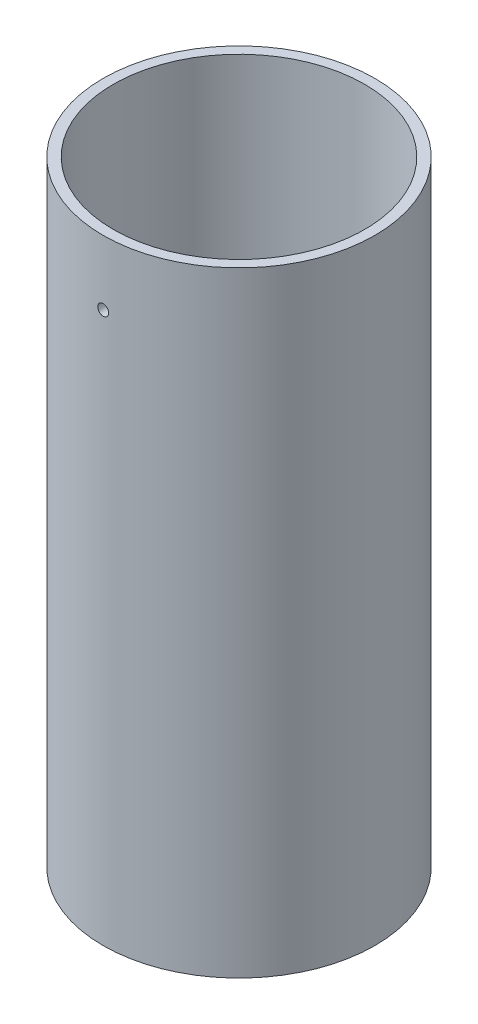
ISO-10303-21;
HEADER;
FILE_DESCRIPTION(('STEP AP214'),'2;1');
FILE_NAME('part.step','',(''),(''),'','','');
FILE_SCHEMA(('AUTOMOTIVE_DESIGN { 1 0 10303 214 1 1 1 1 }'));
ENDSEC;
DATA;
#1=APPLICATION_CONTEXT('core data for automotive mechanical design processes');
#2=APPLICATION_PROTOCOL_DEFINITION('international standard','automotive_design',2000,#1);
#3=PRODUCT_CONTEXT('',#1,'mechanical');
#4=PRODUCT('Part','Part','',(#3));
#5=PRODUCT_RELATED_PRODUCT_CATEGORY('part','',(#4));
#6=PRODUCT_DEFINITION_FORMATION('','',#4);
#7=PRODUCT_DEFINITION_CONTEXT('part definition',#1,'design');
#8=PRODUCT_DEFINITION('design','',#6,#7);
#9=PRODUCT_DEFINITION_SHAPE('','',#8);
#10=(LENGTH_UNIT() NAMED_UNIT(*) SI_UNIT(.MILLI.,.METRE.));
#11=(NAMED_UNIT(*) PLANE_ANGLE_UNIT() SI_UNIT($,.RADIAN.));
#12=(NAMED_UNIT(*) SI_UNIT($,.STERADIAN.) SOLID_ANGLE_UNIT());
#13=UNCERTAINTY_MEASURE_WITH_UNIT(LENGTH_MEASURE(1.E-05),#10,'distance_accuracy_value','');
#14=(GEOMETRIC_REPRESENTATION_CONTEXT(3) GLOBAL_UNCERTAINTY_ASSIGNED_CONTEXT((#13)) GLOBAL_UNIT_ASSIGNED_CONTEXT((#10,
#11,#12)) REPRESENTATION_CONTEXT('',''));
#15=CARTESIAN_POINT('',(0.,0.,0.));
#16=DIRECTION('',(0.,0.,1.));
#17=DIRECTION('',(1.,0.,0.));
#18=AXIS2_PLACEMENT_3D('',#15,#16,#17);
#19=CARTESIAN_POINT('',(0.,90.5,0.));
#20=DIRECTION('',(0.,1.,0.));
#21=DIRECTION('',(0.,0.,1.));
#22=AXIS2_PLACEMENT_3D('',#19,#20,#21);
#23=PLANE('',#22);
#24=CARTESIAN_POINT('',(0.,90.5,0.));
#25=DIRECTION('',(0.,1.,0.));
#26=DIRECTION('',(0.,0.,1.));
#27=AXIS2_PLACEMENT_3D('',#24,#25,#26);
#28=CIRCLE('',#27,40.);
#29=CARTESIAN_POINT('',(0.,90.5,40.));
#30=VERTEX_POINT('',#29);
#31=EDGE_CURVE('E11',#30,#30,#28,.T.);
#32=ORIENTED_EDGE('',*,*,#31,.T.);
#33=EDGE_LOOP('',(#32));
#34=FACE_BOUND('',#33,.T.);
#35=CARTESIAN_POINT('',(0.,90.5,0.));
#36=DIRECTION('',(0.,1.,0.));
#37=DIRECTION('',(0.,0.,1.));
#38=AXIS2_PLACEMENT_3D('',#35,#36,#37);
#39=CIRCLE('',#38,37.);
#40=CARTESIAN_POINT('',(0.,90.5,37.));
#41=VERTEX_POINT('',#40);
#42=EDGE_CURVE('E57',#41,#41,#39,.T.);
#43=ORIENTED_EDGE('',*,*,#42,.F.);
#44=EDGE_LOOP('',(#43));
#45=FACE_BOUND('',#44,.T.);
#46=ADVANCED_FACE('F42',(#34,#45),#23,.T.);
#47=CARTESIAN_POINT('',(0.,-90.5,0.));
#48=DIRECTION('',(0.,1.,0.));
#49=DIRECTION('',(0.,0.,1.));
#50=AXIS2_PLACEMENT_3D('',#47,#48,#49);
#51=PLANE('',#50);
#52=CARTESIAN_POINT('',(0.,-90.5,0.));
#53=DIRECTION('',(0.,1.,0.));
#54=DIRECTION('',(0.,0.,1.));
#55=AXIS2_PLACEMENT_3D('',#52,#53,#54);
#56=CIRCLE('',#55,40.);
#57=CARTESIAN_POINT('',(0.,-90.5,40.));
#58=VERTEX_POINT('',#57);
#59=EDGE_CURVE('E47',#58,#58,#56,.T.);
#60=ORIENTED_EDGE('',*,*,#59,.F.);
#61=EDGE_LOOP('',(#60));
#62=FACE_BOUND('',#61,.T.);
#63=CARTESIAN_POINT('',(0.,-90.5,0.));
#64=DIRECTION('',(0.,1.,0.));
#65=DIRECTION('',(0.,0.,1.));
#66=AXIS2_PLACEMENT_3D('',#63,#64,#65);
#67=CIRCLE('',#66,37.);
#68=CARTESIAN_POINT('',(0.,-90.5,37.));
#69=VERTEX_POINT('',#68);
#70=EDGE_CURVE('E59',#69,#69,#67,.T.);
#71=ORIENTED_EDGE('',*,*,#70,.T.);
#72=EDGE_LOOP('',(#71));
#73=FACE_BOUND('',#72,.T.);
#74=ADVANCED_FACE('F88',(#62,#73),#51,.F.);
#75=CARTESIAN_POINT('',(0.,90.5,0.));
#76=DIRECTION('',(0.,-1.,0.));
#77=DIRECTION('',(0.,0.,-1.));
#78=AXIS2_PLACEMENT_3D('',#75,#76,#77);
#79=CYLINDRICAL_SURFACE('',#78,40.);
#80=CARTESIAN_POINT('',(1.60000000000002,71.5,39.9679871897497));
#81=CARTESIAN_POINT('',(1.599996028156,71.410165877207,39.9679876208717));
#82=CARTESIAN_POINT('',(1.59240881371465,71.320267531253,39.9682933178046));
#83=CARTESIAN_POINT('',(1.56224867919284,71.1429493333858,39.9694833347798));
#84=CARTESIAN_POINT('',(1.53965796514442,71.0555325530991,39.970368341859));
#85=CARTESIAN_POINT('',(1.48013734042648,70.8857718730809,39.9726165681211));
#86=CARTESIAN_POINT('',(1.44321457362409,70.8034254696564,39.9739795490234));
#87=CARTESIAN_POINT('',(1.3560885125119,70.6461222635014,39.9770298394605));
#88=CARTESIAN_POINT('',(1.3058884132296,70.5711636889291,39.9787170709416));
#89=CARTESIAN_POINT('',(1.19359281423791,70.4306887699853,39.9822271054704));
#90=CARTESIAN_POINT('',(1.13149014152547,70.3651781612986,39.984049989861));
#91=CARTESIAN_POINT('',(0.997165935787094,70.2455074381787,39.9876251414729));
#92=CARTESIAN_POINT('',(0.924943995611019,70.1913477806716,39.9893774058492));
#93=CARTESIAN_POINT('',(0.772404583488406,70.0959030968,39.992614366024));
#94=CARTESIAN_POINT('',(0.692084553651112,70.0546221553154,39.994098976865));
#95=CARTESIAN_POINT('',(0.525647043023513,69.9861330493929,39.9966325472317));
#96=CARTESIAN_POINT('',(0.43952959449732,69.9589248066442,39.9976815091817));
#97=CARTESIAN_POINT('',(0.26399107626462,69.9193675407754,39.9992250477132));
#98=CARTESIAN_POINT('',(0.174571815912065,69.907010500359,39.9997199234035));
#99=CARTESIAN_POINT('',(-0.00507312375062449,69.8974816850118,40.0001005151037));
#100=CARTESIAN_POINT('',(-0.0952987984709474,69.9003098237075,39.9999862345785));
#101=CARTESIAN_POINT('',(-0.273941101664329,69.9210643885149,39.9991616477336));
#102=CARTESIAN_POINT('',(-0.362358735522005,69.9389821763251,39.9984516824238));
#103=CARTESIAN_POINT('',(-0.534930145420404,69.9893940407,39.996516113464));
#104=CARTESIAN_POINT('',(-0.619083908347298,70.0218881620922,39.9952905082282));
#105=CARTESIAN_POINT('',(-0.780766590691136,70.1005401913566,39.9924611702967));
#106=CARTESIAN_POINT('',(-0.858293587127873,70.1467020481542,39.9908573283469));
#107=CARTESIAN_POINT('',(-1.00450098254284,70.2513762790805,39.9874522086479));
#108=CARTESIAN_POINT('',(-1.0731813428057,70.3098887072559,39.9856509300346));
#109=CARTESIAN_POINT('',(-1.19979624459249,70.4376519943143,39.9820523813825));
#110=CARTESIAN_POINT('',(-1.25772322469227,70.5069103470278,39.9802551150358));
#111=CARTESIAN_POINT('',(-1.36112880504852,70.6541731115483,39.976868482893));
#112=CARTESIAN_POINT('',(-1.40660740278507,70.7321775251257,39.9752791171389));
#113=CARTESIAN_POINT('',(-1.48382449998366,70.8947225457151,39.972487602237));
#114=CARTESIAN_POINT('',(-1.51556273707911,70.9792632774991,39.9712854604831));
#115=CARTESIAN_POINT('',(-1.56439323446488,71.1524791493401,39.9694042489823));
#116=CARTESIAN_POINT('',(-1.58148556534691,71.2411542694675,39.9687251767142));
#117=CARTESIAN_POINT('',(-1.60052975170363,71.4200559344831,39.9679671398889));
#118=CARTESIAN_POINT('',(-1.60249209152578,71.5102813616248,39.9678877597749));
#119=CARTESIAN_POINT('',(-1.5912479308081,71.6897803032252,39.9683369739617));
#120=CARTESIAN_POINT('',(-1.5780414620833,71.77905381968,39.9688655669873));
#121=CARTESIAN_POINT('',(-1.53684325597172,71.9540854536031,39.9704707649848));
#122=CARTESIAN_POINT('',(-1.5088562982282,72.0398446978447,39.9715471927966));
#123=CARTESIAN_POINT('',(-1.43889640153437,72.205448047273,39.9741265740272));
#124=CARTESIAN_POINT('',(-1.39692341127132,72.2852921307565,39.9756295290108));
#125=CARTESIAN_POINT('',(-1.30015593409464,72.4368469481959,39.9788935637805));
#126=CARTESIAN_POINT('',(-1.24535439376169,72.5085531754586,39.9806547853675));
#127=CARTESIAN_POINT('',(-1.12449576410715,72.6417515074292,39.9842363246424));
#128=CARTESIAN_POINT('',(-1.0584386271819,72.7032435689356,39.9860566425801));
#129=CARTESIAN_POINT('',(-0.916898961562924,72.814303136293,39.9895523979347));
#130=CARTESIAN_POINT('',(-0.841411122219394,72.863863876943,39.9912277528126));
#131=CARTESIAN_POINT('',(-0.683179837798065,72.9496077160597,39.9942435679682));
#132=CARTESIAN_POINT('',(-0.60043641576239,72.9857908570087,39.9955840293094));
#133=CARTESIAN_POINT('',(-0.430068105600365,73.0437405312113,39.99777857307));
#134=CARTESIAN_POINT('',(-0.342444701894073,73.0655114227763,39.9986328025166));
#135=CARTESIAN_POINT('',(-0.164782833705482,73.0940328841025,39.9997591827444));
#136=CARTESIAN_POINT('',(-0.0747443763723748,73.1007834983227,40.0000313352486));
#137=CARTESIAN_POINT('',(0.105124393928597,73.099072288805,39.999962896364));
#138=CARTESIAN_POINT('',(0.194954808409494,73.0906210976659,39.999622733247));
#139=CARTESIAN_POINT('',(0.37192054136271,73.0587681030873,39.9983688186549));
#140=CARTESIAN_POINT('',(0.45905585459611,73.0353662705877,39.9974550660649));
#141=CARTESIAN_POINT('',(0.628160836960379,72.9742782043635,39.9951568419468));
#142=CARTESIAN_POINT('',(0.710130436135376,72.9365917772403,39.9937723640456));
#143=CARTESIAN_POINT('',(0.866578531855504,72.8480067270815,39.9906885570235));
#144=CARTESIAN_POINT('',(0.941057281226071,72.7971085501664,39.9889892385344));
#145=CARTESIAN_POINT('',(1.080461269696,72.6835088632196,39.9854658253245));
#146=CARTESIAN_POINT('',(1.14538082760468,72.6208003841707,39.9836416573394));
#147=CARTESIAN_POINT('',(1.26378987049011,72.4853564350842,39.9800744678724));
#148=CARTESIAN_POINT('',(1.31727652926082,72.4126184930626,39.9783314665381));
#149=CARTESIAN_POINT('',(1.41131752065908,72.259139420425,39.9751223333059));
#150=CARTESIAN_POINT('',(1.45186168761446,72.178392063744,39.973656419413));
#151=CARTESIAN_POINT('',(1.5187698643712,72.0112920181108,39.9711704815395));
#152=CARTESIAN_POINT('',(1.54515071363134,71.9249461231072,39.9701499283196));
#153=CARTESIAN_POINT('',(1.57602340612726,71.7817155564403,39.9689414706509));
#154=CARTESIAN_POINT('',(1.58500324313288,71.7257597407272,39.9685851802809));
#155=CARTESIAN_POINT('',(1.59699279010797,71.6132111200259,39.9681079040351));
#156=CARTESIAN_POINT('',(1.6000025032706,71.5566183153784,39.9679869180334));
#157=CARTESIAN_POINT('',(1.60000000000002,71.5,39.9679871897497));
#158=B_SPLINE_CURVE_WITH_KNOTS('',3,(#80,#81,#82,#83,#84,#85,#86,#87,#88,#89,#90,#91,#92,#93,
#94,#95,#96,#97,#98,#99,#100,#101,#102,#103,#104,#105,#106,#107,#108,#109,#110,#111,#112,#113,
#114,#115,#116,#117,#118,#119,#120,#121,#122,#123,#124,#125,#126,#127,#128,#129,#130,#131,#132,
#133,#134,#135,#136,#137,#138,#139,#140,#141,#142,#143,#144,#145,#146,#147,#148,#149,#150,#151,
#152,#153,#154,#155,#156,#157),.UNSPECIFIED.,.T.,.F.,(4,2,2,2,2,2,2,2,2,2,2,2,2,2,2,2,2,2,2,2,2,
2,2,2,2,2,2,2,2,2,2,2,2,2,2,2,2,2,4),(0.,0.269295697912002,0.538911348940431,0.808392781224753,
1.07780942500839,1.34738894430258,1.61697931328273,1.88665510438796,2.15632939480287,
2.42585803834137,2.69538514879865,2.96475806911961,3.23413181786531,3.50358347099771,
3.77303630328629,4.04267789415934,4.31231953961568,4.58196633354233,4.8516118277926,
5.12107045403026,5.39052851510663,5.65989949344108,5.92927146006963,6.19879188265317,
6.46831344515643,6.73798747154128,7.00766064153216,7.27725222417753,7.54684300884927,
7.81624530695184,8.08564812870384,8.35505459801765,8.62445197147674,8.89400881170929,
9.16363220937241,9.43346686443883,9.70297998543828,9.87270476746283,10.0424294587092),.UNSPECIFIED.);
#159=CARTESIAN_POINT('',(1.60000000000002,71.5,39.9679871897497));
#160=VERTEX_POINT('',#159);
#161=EDGE_CURVE('E63',#160,#160,#158,.T.);
#162=ORIENTED_EDGE('',*,*,#161,.T.);
#163=EDGE_LOOP('',(#162));
#164=FACE_BOUND('',#163,.T.);
#165=ORIENTED_EDGE('',*,*,#31,.F.);
#166=EDGE_LOOP('',(#165));
#167=FACE_BOUND('',#166,.T.);
#168=ORIENTED_EDGE('',*,*,#59,.T.);
#169=EDGE_LOOP('',(#168));
#170=FACE_BOUND('',#169,.T.);
#171=ADVANCED_FACE('F44',(#164,#167,#170),#79,.T.);
#172=CARTESIAN_POINT('',(0.,90.5,0.));
#173=DIRECTION('',(0.,-1.,0.));
#174=DIRECTION('',(0.,0.,-1.));
#175=AXIS2_PLACEMENT_3D('',#172,#173,#174);
#176=CYLINDRICAL_SURFACE('',#175,37.);
#177=CARTESIAN_POINT('',(1.60000000000002,71.5,36.9653892174829));
#178=CARTESIAN_POINT('',(1.59999603054342,71.4101723886392,36.9653896832432));
#179=CARTESIAN_POINT('',(1.5924099115088,71.3202807132814,36.9657201638583));
#180=CARTESIAN_POINT('',(1.56225438196767,71.1429761197338,36.9670066440419));
#181=CARTESIAN_POINT('',(1.53966722146585,71.0555662660793,36.9679633846138));
#182=CARTESIAN_POINT('',(1.48015659066542,70.8858194749499,36.9703938066883));
#183=CARTESIAN_POINT('',(1.4432403125446,70.8034800164891,36.9718672288185));
#184=CARTESIAN_POINT('',(1.35613012525292,70.6461893246555,36.9751646599426));
#185=CARTESIAN_POINT('',(1.30593939234603,70.5712363297572,36.9769885850409));
#186=CARTESIAN_POINT('',(1.19366014698161,70.4307641341554,36.9807831643263));
#187=CARTESIAN_POINT('',(1.13156346163349,70.3652514682302,36.9827539187334));
#188=CARTESIAN_POINT('',(0.997250875491697,70.2455751353676,36.9866191320442));
#189=CARTESIAN_POINT('',(0.925034565834186,70.1914119272039,36.9885135878611));
#190=CARTESIAN_POINT('',(0.772500793844196,70.095955826492,36.992013401995));
#191=CARTESIAN_POINT('',(0.69218031515861,70.0546677496006,36.9936186520465));
#192=CARTESIAN_POINT('',(0.525739505927623,69.9861649166032,36.9963581780017));
#193=CARTESIAN_POINT('',(0.439619211143696,69.9589500737311,36.997492456809));
#194=CARTESIAN_POINT('',(0.264081027285369,69.9193827470727,36.9991615620233));
#195=CARTESIAN_POINT('',(0.174665254690144,69.9070208898472,36.9996967664801));
#196=CARTESIAN_POINT('',(-0.00497376942749632,69.8974815276424,37.0001086711011));
#197=CARTESIAN_POINT('',(-0.0951970158247001,69.9003039263535,36.9999853754419));
#198=CARTESIAN_POINT('',(-0.273826411153133,69.9210451469385,36.9990944952612));
#199=CARTESIAN_POINT('',(-0.362233734741773,69.9389538733863,36.9983273415961));
#200=CARTESIAN_POINT('',(-0.53478604656517,69.9893437465085,36.9962356715939));
#201=CARTESIAN_POINT('',(-0.618931020256039,70.021824942903,36.9949111533551));
#202=CARTESIAN_POINT('',(-0.780602591544464,70.1004492761399,36.9918532418757));
#203=CARTESIAN_POINT('',(-0.858126944240235,70.1465970234879,36.9901197106918));
#204=CARTESIAN_POINT('',(-1.00433208435638,70.2512411124461,36.9864390520064));
#205=CARTESIAN_POINT('',(-1.07301282594635,70.3097375180469,36.984491923398));
#206=CARTESIAN_POINT('',(-1.19964001225586,70.4374755230211,36.9806015267942));
#207=CARTESIAN_POINT('',(-1.25757762273988,70.5067258803079,36.9786582632646));
#208=CARTESIAN_POINT('',(-1.36100587576199,70.6539752148445,36.9749962811153));
#209=CARTESIAN_POINT('',(-1.40649651556585,70.7319741940162,36.9732775625451));
#210=CARTESIAN_POINT('',(-1.48373867342749,70.8945118627325,36.9702586022385));
#211=CARTESIAN_POINT('',(-1.5154898772375,70.9790507018045,36.9689583700739));
#212=CARTESIAN_POINT('',(-1.56434604824171,71.1522660002506,36.9669233835364));
#213=CARTESIAN_POINT('',(-1.58145109787946,71.2409424363313,36.9661886259804));
#214=CARTESIAN_POINT('',(-1.60051851935154,71.4198388137748,36.9653680284807));
#215=CARTESIAN_POINT('',(-1.60249314414219,71.5100574468729,36.9652816634555));
#216=CARTESIAN_POINT('',(-1.59127562160971,71.6895448349462,36.96576621958));
#217=CARTESIAN_POINT('',(-1.57808351159536,71.7788135922574,36.9663371391129));
#218=CARTESIAN_POINT('',(-1.5369171514272,71.9538328917091,36.9680714327612));
#219=CARTESIAN_POINT('',(-1.50894849394506,72.0395847517118,36.9692345827215));
#220=CARTESIAN_POINT('',(-1.43902862809711,72.2051766261902,36.9720220396694));
#221=CARTESIAN_POINT('',(-1.39707735952682,72.2850166152095,36.9736463486426));
#222=CARTESIAN_POINT('',(-1.30035161104611,72.4365747858099,36.9771743157573));
#223=CARTESIAN_POINT('',(-1.24556889159659,72.5082877046141,36.9790781530996));
#224=CARTESIAN_POINT('',(-1.12474738194503,72.64150316042,36.9829499476078));
#225=CARTESIAN_POINT('',(-1.05870853684117,72.7030056476174,36.9849179050863));
#226=CARTESIAN_POINT('',(-0.917196803518668,72.8140954805414,36.9886976485385));
#227=CARTESIAN_POINT('',(-0.8417177036013,72.8636749175196,36.9905093303439));
#228=CARTESIAN_POINT('',(-0.683499525803153,72.9494572164421,36.9937708405542));
#229=CARTESIAN_POINT('',(-0.600760473549994,72.9856601256032,36.9952206702364));
#230=CARTESIAN_POINT('',(-0.430400625629583,73.0436478462892,36.9975945674113));
#231=CARTESIAN_POINT('',(-0.342781563240992,73.0654377420558,36.998518820287));
#232=CARTESIAN_POINT('',(-0.165124518095545,73.0939975575732,36.9997381281904));
#233=CARTESIAN_POINT('',(-0.0750865444453801,73.1007675338628,37.0000331855865));
#234=CARTESIAN_POINT('',(0.104773831755569,73.0990947554039,36.9999608594797));
#235=CARTESIAN_POINT('',(0.194596350316798,73.0906644223208,36.9995940168801));
#236=CARTESIAN_POINT('',(0.371549663758385,73.05885596827,36.998240266909));
#237=CARTESIAN_POINT('',(0.458680453450413,73.035477818492,36.9972533583424));
#238=CARTESIAN_POINT('',(0.62778008563273,72.9744397047996,36.9947705597609));
#239=CARTESIAN_POINT('',(0.709748866513428,72.9367795704645,36.9932746636724));
#240=CARTESIAN_POINT('',(0.866200179790386,72.8482490835114,36.9899422480517));
#241=CARTESIAN_POINT('',(0.94068295794912,72.7973791647622,36.9881057397073));
#242=CARTESIAN_POINT('',(1.08010908547998,72.6838301214224,36.9842972193224));
#243=CARTESIAN_POINT('',(1.14504563250599,72.6211426479118,36.982325112113));
#244=CARTESIAN_POINT('',(1.26349241545108,72.485737621918,36.9784681805332));
#245=CARTESIAN_POINT('',(1.31699982913929,72.4130175993462,36.9765833778109));
#246=CARTESIAN_POINT('',(1.41108821314962,72.2595659247635,36.973112602954));
#247=CARTESIAN_POINT('',(1.45165833830167,72.1788276250858,36.9715268819884));
#248=CARTESIAN_POINT('',(1.51861927713845,72.0117398528054,36.9688372699967));
#249=CARTESIAN_POINT('',(1.54502690225672,71.9253971699794,36.9677328079911));
#250=CARTESIAN_POINT('',(1.57595822599624,71.7820953830683,36.9664237997227));
#251=CARTESIAN_POINT('',(1.58496244653894,71.7260652674139,36.9660375323428));
#252=CARTESIAN_POINT('',(1.59698458433243,71.6133652744192,36.965520094319));
#253=CARTESIAN_POINT('',(1.60000250535351,71.5566953974819,36.9653889235146));
#254=CARTESIAN_POINT('',(1.60000000000002,71.5,36.9653892174829));
#255=B_SPLINE_CURVE_WITH_KNOTS('',3,(#177,#178,#179,#180,#181,#182,#183,#184,#185,#186,#187,
#188,#189,#190,#191,#192,#193,#194,#195,#196,#197,#198,#199,#200,#201,#202,#203,#204,#205,#206,
#207,#208,#209,#210,#211,#212,#213,#214,#215,#216,#217,#218,#219,#220,#221,#222,#223,#224,#225,
#226,#227,#228,#229,#230,#231,#232,#233,#234,#235,#236,#237,#238,#239,#240,#241,#242,#243,#244,
#245,#246,#247,#248,#249,#250,#251,#252,#253,#254),.UNSPECIFIED.,.T.,.F.,(4,2,2,2,2,2,2,2,2,2,2,
2,2,2,2,2,2,2,2,2,2,2,2,2,2,2,2,2,2,2,2,2,2,2,2,2,2,2,4),(0.,0.269275879814107,
0.538870949565112,0.808330876762117,1.07772638679355,1.34730749090636,1.61689949006415,
1.88659220350634,2.15628325418447,2.42580401837751,2.69532307307496,2.96466191491188,
3.2340016757184,3.50343240386707,3.77286452823513,4.0425172374794,4.31217000595845,
4.58182894159788,4.85148635931076,5.12092537931502,5.39036373652559,5.6597001888832,
5.92903780092899,6.19854884086826,6.46806119538683,6.73775183165394,7.0074415159518,
7.27703601544756,7.54662950011884,7.81600277332247,8.08537656571294,8.35475357252355,
8.62412173290416,8.89368091580677,9.16330658502857,9.43315768756212,9.70268775343046,
9.87264343211756,10.0425990037629),.UNSPECIFIED.);
#256=CARTESIAN_POINT('',(1.60000000000002,71.5,36.9653892174829));
#257=VERTEX_POINT('',#256);
#258=EDGE_CURVE('E72',#257,#257,#255,.T.);
#259=ORIENTED_EDGE('',*,*,#258,.F.);
#260=EDGE_LOOP('',(#259));
#261=FACE_BOUND('',#260,.T.);
#262=ORIENTED_EDGE('',*,*,#42,.T.);
#263=EDGE_LOOP('',(#262));
#264=FACE_BOUND('',#263,.T.);
#265=ORIENTED_EDGE('',*,*,#70,.F.);
#266=EDGE_LOOP('',(#265));
#267=FACE_BOUND('',#266,.T.);
#268=ADVANCED_FACE('F79',(#261,#264,#267),#176,.F.);
#269=CARTESIAN_POINT('',(0.,71.5,40.));
#270=DIRECTION('',(0.,0.,1.));
#271=DIRECTION('',(1.,0.,0.));
#272=AXIS2_PLACEMENT_3D('',#269,#270,#271);
#273=CYLINDRICAL_SURFACE('',#272,1.6);
#274=ORIENTED_EDGE('',*,*,#258,.T.);
#275=EDGE_LOOP('',(#274));
#276=FACE_BOUND('',#275,.T.);
#277=ORIENTED_EDGE('',*,*,#161,.F.);
#278=EDGE_LOOP('',(#277));
#279=FACE_BOUND('',#278,.T.);
#280=ADVANCED_FACE('F76',(#276,#279),#273,.F.);
#281=CLOSED_SHELL('',(#46,#74,#171,#268,#280));
#282=MANIFOLD_SOLID_BREP('B2',#281);
#283=ADVANCED_BREP_SHAPE_REPRESENTATION('',(#18,#282),#14);
#284=SHAPE_DEFINITION_REPRESENTATION(#9,#283);
ENDSEC;
END-ISO-10303-21;
